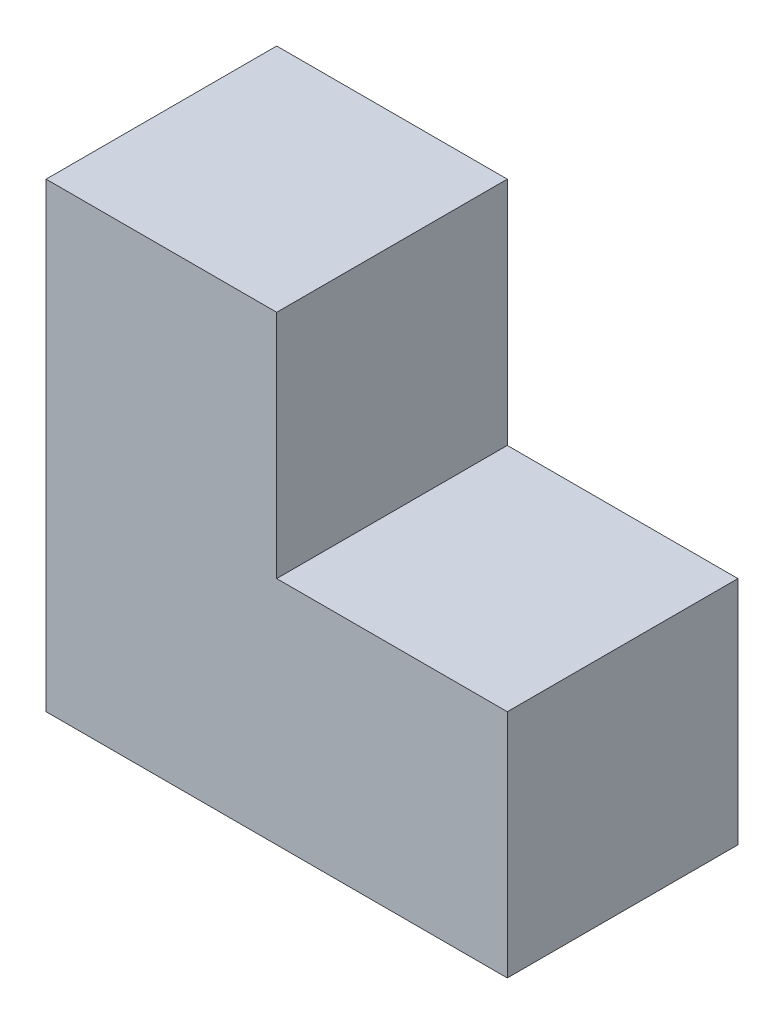
ISO-10303-21;
HEADER;
FILE_DESCRIPTION(('STEP AP214'),'2;1');
FILE_NAME('part.step','',(''),(''),'','','');
FILE_SCHEMA(('AUTOMOTIVE_DESIGN { 1 0 10303 214 1 1 1 1 }'));
ENDSEC;
DATA;
#1=APPLICATION_CONTEXT('core data for automotive mechanical design processes');
#2=APPLICATION_PROTOCOL_DEFINITION('international standard','automotive_design',2000,#1);
#3=PRODUCT_CONTEXT('',#1,'mechanical');
#4=PRODUCT('Part','Part','',(#3));
#5=PRODUCT_RELATED_PRODUCT_CATEGORY('part','',(#4));
#6=PRODUCT_DEFINITION_FORMATION('','',#4);
#7=PRODUCT_DEFINITION_CONTEXT('part definition',#1,'design');
#8=PRODUCT_DEFINITION('design','',#6,#7);
#9=PRODUCT_DEFINITION_SHAPE('','',#8);
#10=(LENGTH_UNIT() NAMED_UNIT(*) SI_UNIT(.MILLI.,.METRE.));
#11=(NAMED_UNIT(*) PLANE_ANGLE_UNIT() SI_UNIT($,.RADIAN.));
#12=(NAMED_UNIT(*) SI_UNIT($,.STERADIAN.) SOLID_ANGLE_UNIT());
#13=UNCERTAINTY_MEASURE_WITH_UNIT(LENGTH_MEASURE(1.E-05),#10,'distance_accuracy_value','');
#14=(GEOMETRIC_REPRESENTATION_CONTEXT(3) GLOBAL_UNCERTAINTY_ASSIGNED_CONTEXT((#13)) GLOBAL_UNIT_ASSIGNED_CONTEXT((#10,
#11,#12)) REPRESENTATION_CONTEXT('',''));
#15=CARTESIAN_POINT('',(0.,0.,0.));
#16=DIRECTION('',(0.,0.,1.));
#17=DIRECTION('',(1.,0.,0.));
#18=AXIS2_PLACEMENT_3D('',#15,#16,#17);
#19=CARTESIAN_POINT('',(0.,0.,-10.));
#20=DIRECTION('',(0.,-1.,0.));
#21=DIRECTION('',(0.,0.,-1.));
#22=AXIS2_PLACEMENT_3D('',#19,#20,#21);
#23=PLANE('',#22);
#24=DIRECTION('',(1.,0.,0.));
#25=VECTOR('',#24,1.);
#26=CARTESIAN_POINT('',(0.,0.,0.));
#27=LINE('',#26,#25);
#28=CARTESIAN_POINT('',(0.,0.,0.));
#29=VERTEX_POINT('',#28);
#30=CARTESIAN_POINT('',(20.,0.,0.));
#31=VERTEX_POINT('',#30);
#32=EDGE_CURVE('E117',#29,#31,#27,.T.);
#33=ORIENTED_EDGE('',*,*,#32,.F.);
#34=DIRECTION('',(0.,0.,1.));
#35=VECTOR('',#34,1.);
#36=CARTESIAN_POINT('',(0.,0.,-10.));
#37=LINE('',#36,#35);
#38=CARTESIAN_POINT('',(0.,0.,-10.));
#39=VERTEX_POINT('',#38);
#40=EDGE_CURVE('E11',#39,#29,#37,.T.);
#41=ORIENTED_EDGE('',*,*,#40,.F.);
#42=DIRECTION('',(1.,0.,0.));
#43=VECTOR('',#42,1.);
#44=CARTESIAN_POINT('',(0.,0.,-10.));
#45=LINE('',#44,#43);
#46=CARTESIAN_POINT('',(20.,0.,-10.));
#47=VERTEX_POINT('',#46);
#48=EDGE_CURVE('E131',#39,#47,#45,.T.);
#49=ORIENTED_EDGE('',*,*,#48,.T.);
#50=DIRECTION('',(0.,0.,1.));
#51=VECTOR('',#50,1.);
#52=CARTESIAN_POINT('',(20.,0.,-10.));
#53=LINE('',#52,#51);
#54=EDGE_CURVE('E35',#47,#31,#53,.T.);
#55=ORIENTED_EDGE('',*,*,#54,.T.);
#56=EDGE_LOOP('',(#33,#41,#49,#55));
#57=FACE_BOUND('',#56,.T.);
#58=ADVANCED_FACE('F32',(#57),#23,.T.);
#59=CARTESIAN_POINT('',(0.,0.,-10.));
#60=DIRECTION('',(-1.,0.,0.));
#61=DIRECTION('',(0.,0.,1.));
#62=AXIS2_PLACEMENT_3D('',#59,#60,#61);
#63=PLANE('',#62);
#64=DIRECTION('',(0.,-1.,0.));
#65=VECTOR('',#64,1.);
#66=CARTESIAN_POINT('',(0.,0.,0.));
#67=LINE('',#66,#65);
#68=CARTESIAN_POINT('',(0.,20.,0.));
#69=VERTEX_POINT('',#68);
#70=EDGE_CURVE('E129',#69,#29,#67,.T.);
#71=ORIENTED_EDGE('',*,*,#70,.F.);
#72=DIRECTION('',(0.,0.,1.));
#73=VECTOR('',#72,1.);
#74=CARTESIAN_POINT('',(0.,20.,-10.));
#75=LINE('',#74,#73);
#76=CARTESIAN_POINT('',(0.,20.,-10.));
#77=VERTEX_POINT('',#76);
#78=EDGE_CURVE('E41',#77,#69,#75,.T.);
#79=ORIENTED_EDGE('',*,*,#78,.F.);
#80=DIRECTION('',(0.,-1.,0.));
#81=VECTOR('',#80,1.);
#82=CARTESIAN_POINT('',(0.,0.,-10.));
#83=LINE('',#82,#81);
#84=EDGE_CURVE('E107',#77,#39,#83,.T.);
#85=ORIENTED_EDGE('',*,*,#84,.T.);
#86=ORIENTED_EDGE('',*,*,#40,.T.);
#87=EDGE_LOOP('',(#71,#79,#85,#86));
#88=FACE_BOUND('',#87,.T.);
#89=ADVANCED_FACE('F139',(#88),#63,.T.);
#90=CARTESIAN_POINT('',(0.,20.,-10.));
#91=DIRECTION('',(0.,1.,0.));
#92=DIRECTION('',(0.,0.,1.));
#93=AXIS2_PLACEMENT_3D('',#90,#91,#92);
#94=PLANE('',#93);
#95=DIRECTION('',(-1.,0.,0.));
#96=VECTOR('',#95,1.);
#97=CARTESIAN_POINT('',(0.,20.,0.));
#98=LINE('',#97,#96);
#99=CARTESIAN_POINT('',(10.,20.,0.));
#100=VERTEX_POINT('',#99);
#101=EDGE_CURVE('E94',#100,#69,#98,.T.);
#102=ORIENTED_EDGE('',*,*,#101,.F.);
#103=DIRECTION('',(0.,0.,1.));
#104=VECTOR('',#103,1.);
#105=CARTESIAN_POINT('',(10.,20.,-10.));
#106=LINE('',#105,#104);
#107=CARTESIAN_POINT('',(10.,20.,-10.));
#108=VERTEX_POINT('',#107);
#109=EDGE_CURVE('E89',#108,#100,#106,.T.);
#110=ORIENTED_EDGE('',*,*,#109,.F.);
#111=DIRECTION('',(-1.,0.,0.));
#112=VECTOR('',#111,1.);
#113=CARTESIAN_POINT('',(0.,20.,-10.));
#114=LINE('',#113,#112);
#115=EDGE_CURVE('E92',#108,#77,#114,.T.);
#116=ORIENTED_EDGE('',*,*,#115,.T.);
#117=ORIENTED_EDGE('',*,*,#78,.T.);
#118=EDGE_LOOP('',(#102,#110,#116,#117));
#119=FACE_BOUND('',#118,.T.);
#120=ADVANCED_FACE('F91',(#119),#94,.T.);
#121=CARTESIAN_POINT('',(10.,20.,-10.));
#122=DIRECTION('',(1.,0.,0.));
#123=DIRECTION('',(0.,1.,0.));
#124=AXIS2_PLACEMENT_3D('',#121,#122,#123);
#125=PLANE('',#124);
#126=DIRECTION('',(0.,1.,0.));
#127=VECTOR('',#126,1.);
#128=CARTESIAN_POINT('',(10.,20.,0.));
#129=LINE('',#128,#127);
#130=CARTESIAN_POINT('',(10.,10.,0.));
#131=VERTEX_POINT('',#130);
#132=EDGE_CURVE('E126',#131,#100,#129,.T.);
#133=ORIENTED_EDGE('',*,*,#132,.F.);
#134=DIRECTION('',(0.,0.,1.));
#135=VECTOR('',#134,1.);
#136=CARTESIAN_POINT('',(10.,10.,-10.));
#137=LINE('',#136,#135);
#138=CARTESIAN_POINT('',(10.,10.,-10.));
#139=VERTEX_POINT('',#138);
#140=EDGE_CURVE('E99',#139,#131,#137,.T.);
#141=ORIENTED_EDGE('',*,*,#140,.F.);
#142=DIRECTION('',(0.,1.,0.));
#143=VECTOR('',#142,1.);
#144=CARTESIAN_POINT('',(10.,20.,-10.));
#145=LINE('',#144,#143);
#146=EDGE_CURVE('E105',#139,#108,#145,.T.);
#147=ORIENTED_EDGE('',*,*,#146,.T.);
#148=ORIENTED_EDGE('',*,*,#109,.T.);
#149=EDGE_LOOP('',(#133,#141,#147,#148));
#150=FACE_BOUND('',#149,.T.);
#151=ADVANCED_FACE('F109',(#150),#125,.T.);
#152=CARTESIAN_POINT('',(20.,10.,-10.));
#153=DIRECTION('',(0.,1.,0.));
#154=DIRECTION('',(-1.,0.,0.));
#155=AXIS2_PLACEMENT_3D('',#152,#153,#154);
#156=PLANE('',#155);
#157=DIRECTION('',(-1.,0.,0.));
#158=VECTOR('',#157,1.);
#159=CARTESIAN_POINT('',(20.,10.,0.));
#160=LINE('',#159,#158);
#161=CARTESIAN_POINT('',(20.,10.,0.));
#162=VERTEX_POINT('',#161);
#163=EDGE_CURVE('E123',#162,#131,#160,.T.);
#164=ORIENTED_EDGE('',*,*,#163,.F.);
#165=DIRECTION('',(0.,0.,1.));
#166=VECTOR('',#165,1.);
#167=CARTESIAN_POINT('',(20.,10.,-10.));
#168=LINE('',#167,#166);
#169=CARTESIAN_POINT('',(20.,10.,-10.));
#170=VERTEX_POINT('',#169);
#171=EDGE_CURVE('E134',#170,#162,#168,.T.);
#172=ORIENTED_EDGE('',*,*,#171,.F.);
#173=DIRECTION('',(-1.,0.,0.));
#174=VECTOR('',#173,1.);
#175=CARTESIAN_POINT('',(20.,10.,-10.));
#176=LINE('',#175,#174);
#177=EDGE_CURVE('E110',#170,#139,#176,.T.);
#178=ORIENTED_EDGE('',*,*,#177,.T.);
#179=ORIENTED_EDGE('',*,*,#140,.T.);
#180=EDGE_LOOP('',(#164,#172,#178,#179));
#181=FACE_BOUND('',#180,.T.);
#182=ADVANCED_FACE('F152',(#181),#156,.T.);
#183=CARTESIAN_POINT('',(20.,0.,-10.));
#184=DIRECTION('',(1.,0.,0.));
#185=DIRECTION('',(0.,0.,-1.));
#186=AXIS2_PLACEMENT_3D('',#183,#184,#185);
#187=PLANE('',#186);
#188=DIRECTION('',(0.,1.,0.));
#189=VECTOR('',#188,1.);
#190=CARTESIAN_POINT('',(20.,0.,0.));
#191=LINE('',#190,#189);
#192=EDGE_CURVE('E120',#31,#162,#191,.T.);
#193=ORIENTED_EDGE('',*,*,#192,.F.);
#194=ORIENTED_EDGE('',*,*,#54,.F.);
#195=DIRECTION('',(0.,1.,0.));
#196=VECTOR('',#195,1.);
#197=CARTESIAN_POINT('',(20.,0.,-10.));
#198=LINE('',#197,#196);
#199=EDGE_CURVE('E112',#47,#170,#198,.T.);
#200=ORIENTED_EDGE('',*,*,#199,.T.);
#201=ORIENTED_EDGE('',*,*,#171,.T.);
#202=EDGE_LOOP('',(#193,#194,#200,#201));
#203=FACE_BOUND('',#202,.T.);
#204=ADVANCED_FACE('F136',(#203),#187,.T.);
#205=CARTESIAN_POINT('',(0.,0.,-10.));
#206=DIRECTION('',(0.,0.,1.));
#207=DIRECTION('',(1.,0.,0.));
#208=AXIS2_PLACEMENT_3D('',#205,#206,#207);
#209=PLANE('',#208);
#210=ORIENTED_EDGE('',*,*,#48,.F.);
#211=ORIENTED_EDGE('',*,*,#84,.F.);
#212=ORIENTED_EDGE('',*,*,#115,.F.);
#213=ORIENTED_EDGE('',*,*,#146,.F.);
#214=ORIENTED_EDGE('',*,*,#177,.F.);
#215=ORIENTED_EDGE('',*,*,#199,.F.);
#216=EDGE_LOOP('',(#210,#211,#212,#213,#214,#215));
#217=FACE_BOUND('',#216,.T.);
#218=ADVANCED_FACE('F103',(#217),#209,.F.);
#219=CARTESIAN_POINT('',(0.,0.,0.));
#220=DIRECTION('',(0.,0.,1.));
#221=DIRECTION('',(1.,0.,0.));
#222=AXIS2_PLACEMENT_3D('',#219,#220,#221);
#223=PLANE('',#222);
#224=ORIENTED_EDGE('',*,*,#32,.T.);
#225=ORIENTED_EDGE('',*,*,#192,.T.);
#226=ORIENTED_EDGE('',*,*,#163,.T.);
#227=ORIENTED_EDGE('',*,*,#132,.T.);
#228=ORIENTED_EDGE('',*,*,#101,.T.);
#229=ORIENTED_EDGE('',*,*,#70,.T.);
#230=EDGE_LOOP('',(#224,#225,#226,#227,#228,#229));
#231=FACE_BOUND('',#230,.T.);
#232=ADVANCED_FACE('F138',(#231),#223,.T.);
#233=CLOSED_SHELL('',(#58,#89,#120,#151,#182,#204,#218,#232));
#234=MANIFOLD_SOLID_BREP('B2',#233);
#235=ADVANCED_BREP_SHAPE_REPRESENTATION('',(#18,#234),#14);
#236=SHAPE_DEFINITION_REPRESENTATION(#9,#235);
ENDSEC;
END-ISO-10303-21;
